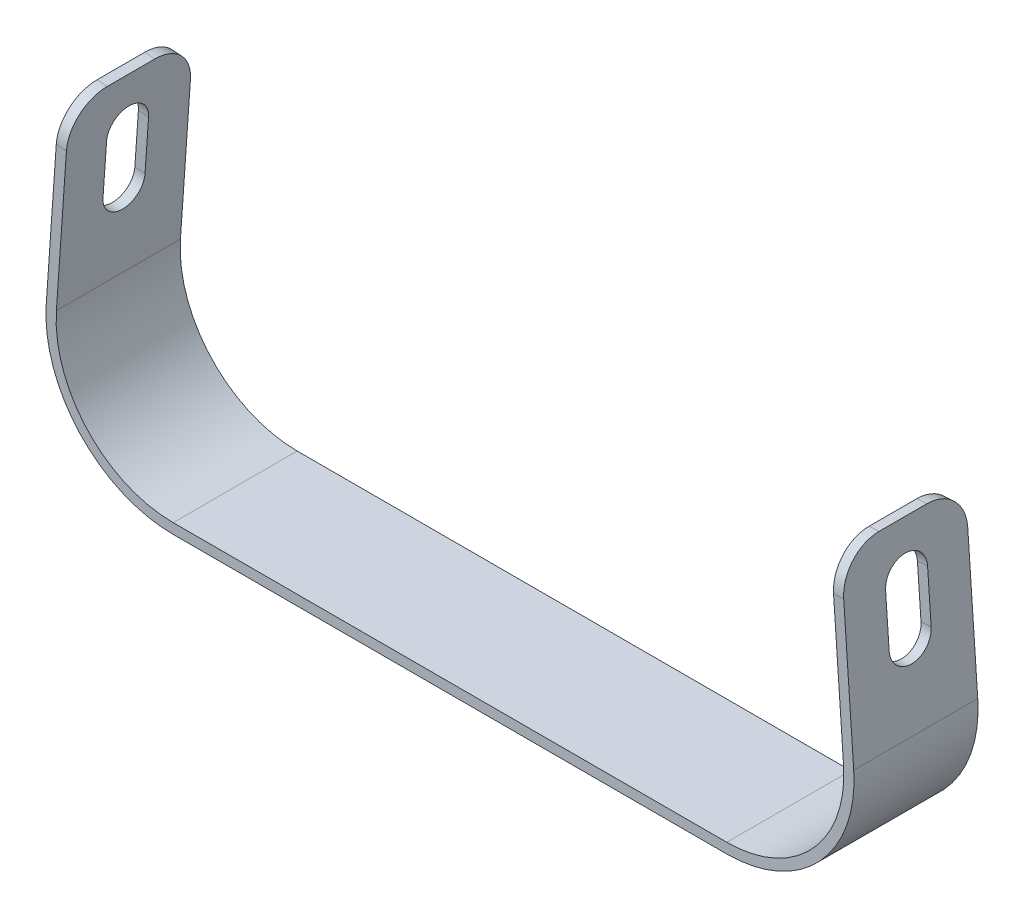
ISO-10303-21;
HEADER;
FILE_DESCRIPTION(('STEP AP214'),'2;1');
FILE_NAME('part.step','',(''),(''),'','','');
FILE_SCHEMA(('AUTOMOTIVE_DESIGN { 1 0 10303 214 1 1 1 1 }'));
ENDSEC;
DATA;
#1=APPLICATION_CONTEXT('core data for automotive mechanical design processes');
#2=APPLICATION_PROTOCOL_DEFINITION('international standard','automotive_design',2000,#1);
#3=PRODUCT_CONTEXT('',#1,'mechanical');
#4=PRODUCT('Part','Part','',(#3));
#5=PRODUCT_RELATED_PRODUCT_CATEGORY('part','',(#4));
#6=PRODUCT_DEFINITION_FORMATION('','',#4);
#7=PRODUCT_DEFINITION_CONTEXT('part definition',#1,'design');
#8=PRODUCT_DEFINITION('design','',#6,#7);
#9=PRODUCT_DEFINITION_SHAPE('','',#8);
#10=(LENGTH_UNIT() NAMED_UNIT(*) SI_UNIT(.MILLI.,.METRE.));
#11=(NAMED_UNIT(*) PLANE_ANGLE_UNIT() SI_UNIT($,.RADIAN.));
#12=(NAMED_UNIT(*) SI_UNIT($,.STERADIAN.) SOLID_ANGLE_UNIT());
#13=UNCERTAINTY_MEASURE_WITH_UNIT(LENGTH_MEASURE(1.E-05),#10,'distance_accuracy_value','');
#14=(GEOMETRIC_REPRESENTATION_CONTEXT(3) GLOBAL_UNCERTAINTY_ASSIGNED_CONTEXT((#13)) GLOBAL_UNIT_ASSIGNED_CONTEXT((#10,
#11,#12)) REPRESENTATION_CONTEXT('',''));
#15=CARTESIAN_POINT('',(0.,0.,0.));
#16=DIRECTION('',(0.,0.,1.));
#17=DIRECTION('',(1.,0.,0.));
#18=AXIS2_PLACEMENT_3D('',#15,#16,#17);
#19=CARTESIAN_POINT('',(452.110985161686,-170.979477552014,-494.449999926082));
#20=DIRECTION('',(0.997564050259824,-0.0697564737441253,0.));
#21=DIRECTION('',(0.0697564737441253,0.997564050259824,0.));
#22=AXIS2_PLACEMENT_3D('',#19,#20,#21);
#23=CYLINDRICAL_SURFACE('',#22,6.);
#24=DIRECTION('',(0.997564050259824,-0.0697564737441253,0.));
#25=VECTOR('',#24,1.);
#26=CARTESIAN_POINT('',(452.110985161686,-170.979477552014,-488.449999926082));
#27=LINE('',#26,#25);
#28=CARTESIAN_POINT('',(414.620123332679,-168.357861107297,-488.449999926082));
#29=VERTEX_POINT('',#28);
#30=CARTESIAN_POINT('',(416.216225813094,-168.469471465288,-488.449999926082));
#31=VERTEX_POINT('',#30);
#32=EDGE_CURVE('E254',#29,#31,#27,.T.);
#33=ORIENTED_EDGE('',*,*,#32,.T.);
#34=CARTESIAN_POINT('',(416.216225813094,-168.469471465287,-494.449999926082));
#35=DIRECTION('',(0.997564050259824,-0.0697564737441253,0.));
#36=DIRECTION('',(0.0697564737441253,0.997564050259824,0.));
#37=AXIS2_PLACEMENT_3D('',#34,#35,#36);
#38=CIRCLE('',#37,6.);
#39=CARTESIAN_POINT('',(416.634764655559,-162.484087163729,-494.449999926082));
#40=VERTEX_POINT('',#39);
#41=EDGE_CURVE('E350',#31,#40,#38,.F.);
#42=ORIENTED_EDGE('',*,*,#41,.T.);
#43=DIRECTION('',(-0.997564050259824,0.0697564737441253,0.));
#44=VECTOR('',#43,1.);
#45=CARTESIAN_POINT('',(416.634764655559,-162.484087163729,-494.449999926082));
#46=LINE('',#45,#44);
#47=CARTESIAN_POINT('',(415.038662175143,-162.372476805738,-494.449999926082));
#48=VERTEX_POINT('',#47);
#49=EDGE_CURVE('E247',#48,#40,#46,.F.);
#50=ORIENTED_EDGE('',*,*,#49,.F.);
#51=CARTESIAN_POINT('',(414.620123332678,-168.357861107297,-494.449999926082));
#52=DIRECTION('',(0.997564050259824,-0.0697564737441253,0.));
#53=DIRECTION('',(0.0697564737441253,0.997564050259824,0.));
#54=AXIS2_PLACEMENT_3D('',#51,#52,#53);
#55=CIRCLE('',#54,6.);
#56=EDGE_CURVE('E331',#29,#48,#55,.F.);
#57=ORIENTED_EDGE('',*,*,#56,.F.);
#58=EDGE_LOOP('',(#33,#42,#50,#57));
#59=FACE_BOUND('',#58,.T.);
#60=ADVANCED_FACE('F16',(#59),#23,.T.);
#61=CARTESIAN_POINT('',(416.634764655559,-162.484087163729,-510.95));
#62=DIRECTION('',(0.0697564737441253,0.997564050259824,0.));
#63=DIRECTION('',(-0.997564050259824,0.0697564737441253,0.));
#64=AXIS2_PLACEMENT_3D('',#61,#62,#63);
#65=PLANE('',#64);
#66=DIRECTION('',(0.997564050259824,-0.0697564737441253,0.));
#67=VECTOR('',#66,1.);
#68=CARTESIAN_POINT('',(452.529524004151,-164.994093250455,-501.95));
#69=LINE('',#68,#67);
#70=CARTESIAN_POINT('',(415.038662175144,-162.372476805738,-501.95));
#71=VERTEX_POINT('',#70);
#72=CARTESIAN_POINT('',(416.634764655559,-162.484087163729,-501.95));
#73=VERTEX_POINT('',#72);
#74=EDGE_CURVE('E243',#71,#73,#69,.T.);
#75=ORIENTED_EDGE('',*,*,#74,.F.);
#76=DIRECTION('',(0.,0.,1.));
#77=VECTOR('',#76,1.);
#78=CARTESIAN_POINT('',(415.038662175144,-162.372476805738,-133.95));
#79=LINE('',#78,#77);
#80=EDGE_CURVE('E330',#48,#71,#79,.F.);
#81=ORIENTED_EDGE('',*,*,#80,.F.);
#82=ORIENTED_EDGE('',*,*,#49,.T.);
#83=DIRECTION('',(0.,0.,1.));
#84=VECTOR('',#83,1.);
#85=CARTESIAN_POINT('',(416.634764655559,-162.484087163729,-133.95));
#86=LINE('',#85,#84);
#87=EDGE_CURVE('E349',#40,#73,#86,.F.);
#88=ORIENTED_EDGE('',*,*,#87,.T.);
#89=EDGE_LOOP('',(#75,#81,#82,#88));
#90=FACE_BOUND('',#89,.T.);
#91=ADVANCED_FACE('F506',(#90),#65,.T.);
#92=CARTESIAN_POINT('',(452.110985161686,-170.979477552014,-501.95));
#93=DIRECTION('',(0.997564050259824,-0.0697564737441253,0.));
#94=DIRECTION('',(0.0697564737441253,0.997564050259824,0.));
#95=AXIS2_PLACEMENT_3D('',#92,#93,#94);
#96=CYLINDRICAL_SURFACE('',#95,6.);
#97=ORIENTED_EDGE('',*,*,#74,.T.);
#98=CARTESIAN_POINT('',(416.216225813094,-168.469471465287,-501.95));
#99=DIRECTION('',(0.997564050259824,-0.0697564737441253,0.));
#100=DIRECTION('',(0.0697564737441253,0.997564050259824,0.));
#101=AXIS2_PLACEMENT_3D('',#98,#99,#100);
#102=CIRCLE('',#101,6.);
#103=CARTESIAN_POINT('',(416.216225813094,-168.469471465288,-507.95));
#104=VERTEX_POINT('',#103);
#105=EDGE_CURVE('E345',#73,#104,#102,.F.);
#106=ORIENTED_EDGE('',*,*,#105,.T.);
#107=DIRECTION('',(0.997564050259824,-0.0697564737441253,0.));
#108=VECTOR('',#107,1.);
#109=CARTESIAN_POINT('',(452.110985161686,-170.979477552015,-507.95));
#110=LINE('',#109,#108);
#111=CARTESIAN_POINT('',(414.620123332679,-168.357861107297,-507.95));
#112=VERTEX_POINT('',#111);
#113=EDGE_CURVE('E244',#104,#112,#110,.F.);
#114=ORIENTED_EDGE('',*,*,#113,.T.);
#115=CARTESIAN_POINT('',(414.620123332679,-168.357861107297,-501.95));
#116=DIRECTION('',(0.997564050259824,-0.0697564737441253,0.));
#117=DIRECTION('',(0.0697564737441253,0.997564050259824,0.));
#118=AXIS2_PLACEMENT_3D('',#115,#116,#117);
#119=CIRCLE('',#118,6.);
#120=EDGE_CURVE('E326',#71,#112,#119,.F.);
#121=ORIENTED_EDGE('',*,*,#120,.F.);
#122=EDGE_LOOP('',(#97,#106,#114,#121));
#123=FACE_BOUND('',#122,.T.);
#124=ADVANCED_FACE('F503',(#123),#96,.T.);
#125=CARTESIAN_POINT('',(413.922558595237,-178.333501609896,-501.499999963041));
#126=DIRECTION('',(0.,0.,1.));
#127=DIRECTION('',(0.,-1.,0.));
#128=AXIS2_PLACEMENT_3D('',#125,#126,#127);
#129=PLANE('',#128);
#130=DIRECTION('',(-0.0697564737441253,-0.997564050259824,0.));
#131=VECTOR('',#130,1.);
#132=CARTESIAN_POINT('',(411.375149748335,-237.700084590764,-501.499999963041));
#133=LINE('',#132,#131);
#134=CARTESIAN_POINT('',(415.518661075653,-178.445111967887,-501.499999963041));
#135=VERTEX_POINT('',#134);
#136=CARTESIAN_POINT('',(416.076712865606,-170.464599565808,-501.499999963041));
#137=VERTEX_POINT('',#136);
#138=EDGE_CURVE('E335',#135,#137,#133,.F.);
#139=ORIENTED_EDGE('',*,*,#138,.T.);
#140=DIRECTION('',(-0.997564050259824,0.0697564737441253,0.));
#141=VECTOR('',#140,1.);
#142=CARTESIAN_POINT('',(414.480610385191,-170.352989207817,-501.499999963041));
#143=LINE('',#142,#141);
#144=CARTESIAN_POINT('',(414.48061038519,-170.352989207817,-501.499999963041));
#145=VERTEX_POINT('',#144);
#146=EDGE_CURVE('E240',#137,#145,#143,.T.);
#147=ORIENTED_EDGE('',*,*,#146,.T.);
#148=DIRECTION('',(-0.0697564737441253,-0.997564050259824,0.));
#149=VECTOR('',#148,1.);
#150=CARTESIAN_POINT('',(409.77904726792,-237.588474232773,-501.499999963041));
#151=LINE('',#150,#149);
#152=CARTESIAN_POINT('',(413.922558595237,-178.333501609896,-501.499999963041));
#153=VERTEX_POINT('',#152);
#154=EDGE_CURVE('E325',#153,#145,#151,.F.);
#155=ORIENTED_EDGE('',*,*,#154,.F.);
#156=DIRECTION('',(-0.997564050259824,0.0697564737441253,0.));
#157=VECTOR('',#156,1.);
#158=CARTESIAN_POINT('',(413.922558595237,-178.333501609896,-501.499999963041));
#159=LINE('',#158,#157);
#160=EDGE_CURVE('E233',#153,#135,#159,.F.);
#161=ORIENTED_EDGE('',*,*,#160,.T.);
#162=EDGE_LOOP('',(#139,#147,#155,#161));
#163=FACE_BOUND('',#162,.T.);
#164=ADVANCED_FACE('F567',(#163),#129,.T.);
#165=CARTESIAN_POINT('',(414.480610385191,-170.352989207817,-498.199999963041));
#166=DIRECTION('',(-0.997564050259824,0.0697564737441253,0.));
#167=DIRECTION('',(-0.0697564737441253,-0.997564050259824,0.));
#168=AXIS2_PLACEMENT_3D('',#165,#166,#167);
#169=CYLINDRICAL_SURFACE('',#168,3.3);
#170=ORIENTED_EDGE('',*,*,#146,.F.);
#171=CARTESIAN_POINT('',(416.076712865606,-170.464599565808,-498.199999963041));
#172=DIRECTION('',(-0.997564050259824,0.0697564737441253,0.));
#173=DIRECTION('',(-0.0697564737441253,-0.997564050259824,0.));
#174=AXIS2_PLACEMENT_3D('',#171,#172,#173);
#175=CIRCLE('',#174,3.3);
#176=CARTESIAN_POINT('',(416.076712865606,-170.464599565808,-494.899999963041));
#177=VERTEX_POINT('',#176);
#178=EDGE_CURVE('E341',#137,#177,#175,.F.);
#179=ORIENTED_EDGE('',*,*,#178,.T.);
#180=DIRECTION('',(0.997564050259809,-0.0697564737443516,0.));
#181=VECTOR('',#180,1.);
#182=CARTESIAN_POINT('',(414.48061038519,-170.352989207817,-494.899999963041));
#183=LINE('',#182,#181);
#184=CARTESIAN_POINT('',(414.48061038519,-170.352989207817,-494.899999963041));
#185=VERTEX_POINT('',#184);
#186=EDGE_CURVE('E236',#185,#177,#183,.T.);
#187=ORIENTED_EDGE('',*,*,#186,.F.);
#188=CARTESIAN_POINT('',(414.48061038519,-170.352989207817,-498.199999963041));
#189=DIRECTION('',(-0.997564050259824,0.0697564737441253,0.));
#190=DIRECTION('',(-0.0697564737441253,-0.997564050259824,0.));
#191=AXIS2_PLACEMENT_3D('',#188,#189,#190);
#192=CIRCLE('',#191,3.3);
#193=EDGE_CURVE('E321',#145,#185,#192,.F.);
#194=ORIENTED_EDGE('',*,*,#193,.F.);
#195=EDGE_LOOP('',(#170,#179,#187,#194));
#196=FACE_BOUND('',#195,.T.);
#197=ADVANCED_FACE('F563',(#196),#169,.F.);
#198=CARTESIAN_POINT('',(414.480610385191,-170.352989207817,-494.899999963041));
#199=DIRECTION('',(0.,0.,-1.));
#200=DIRECTION('',(0.,1.,0.));
#201=AXIS2_PLACEMENT_3D('',#198,#199,#200);
#202=PLANE('',#201);
#203=DIRECTION('',(-0.0697564737441253,-0.997564050259824,0.));
#204=VECTOR('',#203,1.);
#205=CARTESIAN_POINT('',(411.375149748335,-237.700084590764,-494.899999963041));
#206=LINE('',#205,#204);
#207=CARTESIAN_POINT('',(415.518661075653,-178.445111967886,-494.899999963041));
#208=VERTEX_POINT('',#207);
#209=EDGE_CURVE('E340',#177,#208,#206,.T.);
#210=ORIENTED_EDGE('',*,*,#209,.T.);
#211=DIRECTION('',(-0.997564050259824,0.0697564737441253,0.));
#212=VECTOR('',#211,1.);
#213=CARTESIAN_POINT('',(413.922558595237,-178.333501609895,-494.899999963041));
#214=LINE('',#213,#212);
#215=CARTESIAN_POINT('',(413.922558595237,-178.333501609896,-494.899999963041));
#216=VERTEX_POINT('',#215);
#217=EDGE_CURVE('E196',#208,#216,#214,.T.);
#218=ORIENTED_EDGE('',*,*,#217,.T.);
#219=DIRECTION('',(-0.0697564737441253,-0.997564050259824,0.));
#220=VECTOR('',#219,1.);
#221=CARTESIAN_POINT('',(409.77904726792,-237.588474232773,-494.899999963041));
#222=LINE('',#221,#220);
#223=EDGE_CURVE('E320',#185,#216,#222,.T.);
#224=ORIENTED_EDGE('',*,*,#223,.F.);
#225=ORIENTED_EDGE('',*,*,#186,.T.);
#226=EDGE_LOOP('',(#210,#218,#224,#225));
#227=FACE_BOUND('',#226,.T.);
#228=ADVANCED_FACE('F559',(#227),#202,.T.);
#229=CARTESIAN_POINT('',(413.922558595237,-178.333501609896,-498.199999963041));
#230=DIRECTION('',(-0.997564050259824,0.0697564737441253,0.));
#231=DIRECTION('',(-0.0697564737441253,-0.997564050259824,0.));
#232=AXIS2_PLACEMENT_3D('',#229,#230,#231);
#233=CYLINDRICAL_SURFACE('',#232,3.3);
#234=ORIENTED_EDGE('',*,*,#217,.F.);
#235=CARTESIAN_POINT('',(415.518661075653,-178.445111967887,-498.199999963041));
#236=DIRECTION('',(-0.997564050259824,0.0697564737441253,0.));
#237=DIRECTION('',(-0.0697564737441253,-0.997564050259824,0.));
#238=AXIS2_PLACEMENT_3D('',#235,#236,#237);
#239=CIRCLE('',#238,3.3);
#240=EDGE_CURVE('E336',#208,#135,#239,.F.);
#241=ORIENTED_EDGE('',*,*,#240,.T.);
#242=ORIENTED_EDGE('',*,*,#160,.F.);
#243=CARTESIAN_POINT('',(413.922558595237,-178.333501609896,-498.199999963041));
#244=DIRECTION('',(-0.997564050259824,0.0697564737441253,0.));
#245=DIRECTION('',(-0.0697564737441253,-0.997564050259824,0.));
#246=AXIS2_PLACEMENT_3D('',#243,#244,#245);
#247=CIRCLE('',#246,3.3);
#248=EDGE_CURVE('E316',#216,#153,#247,.F.);
#249=ORIENTED_EDGE('',*,*,#248,.F.);
#250=EDGE_LOOP('',(#234,#241,#242,#249));
#251=FACE_BOUND('',#250,.T.);
#252=ADVANCED_FACE('F556',(#251),#233,.F.);
#253=CARTESIAN_POINT('',(538.540694391833,-170.352989207817,-498.199999963041));
#254=DIRECTION('',(0.997564050259824,0.0697564737441253,0.));
#255=DIRECTION('',(-0.0697564737441253,0.997564050259824,0.));
#256=AXIS2_PLACEMENT_3D('',#253,#254,#255);
#257=CYLINDRICAL_SURFACE('',#256,3.3);
#258=DIRECTION('',(0.997564050259809,0.0697564737443516,0.));
#259=VECTOR('',#258,1.);
#260=CARTESIAN_POINT('',(536.944591911417,-170.464599565808,-494.899999963041));
#261=LINE('',#260,#259);
#262=CARTESIAN_POINT('',(536.944591911417,-170.464599565808,-494.899999963041));
#263=VERTEX_POINT('',#262);
#264=CARTESIAN_POINT('',(538.540694391833,-170.352989207817,-494.899999963041));
#265=VERTEX_POINT('',#264);
#266=EDGE_CURVE('E175',#263,#265,#261,.T.);
#267=ORIENTED_EDGE('',*,*,#266,.F.);
#268=CARTESIAN_POINT('',(536.944591911417,-170.464599565808,-498.199999963041));
#269=DIRECTION('',(0.997564050259824,0.0697564737441253,0.));
#270=DIRECTION('',(-0.0697564737441253,0.997564050259824,0.));
#271=AXIS2_PLACEMENT_3D('',#268,#269,#270);
#272=CIRCLE('',#271,3.3);
#273=CARTESIAN_POINT('',(536.944591911417,-170.464599565808,-501.499999963041));
#274=VERTEX_POINT('',#273);
#275=EDGE_CURVE('E19',#263,#274,#272,.F.);
#276=ORIENTED_EDGE('',*,*,#275,.T.);
#277=DIRECTION('',(-0.997564050259809,-0.0697564737443516,0.));
#278=VECTOR('',#277,1.);
#279=CARTESIAN_POINT('',(538.540694391833,-170.352989207817,-501.499999963041));
#280=LINE('',#279,#278);
#281=CARTESIAN_POINT('',(538.540694391833,-170.352989207817,-501.499999963041));
#282=VERTEX_POINT('',#281);
#283=EDGE_CURVE('E180',#282,#274,#280,.T.);
#284=ORIENTED_EDGE('',*,*,#283,.F.);
#285=CARTESIAN_POINT('',(538.540694391833,-170.352989207817,-498.199999963041));
#286=DIRECTION('',(0.997564050259824,0.0697564737441253,0.));
#287=DIRECTION('',(-0.0697564737441253,0.997564050259824,0.));
#288=AXIS2_PLACEMENT_3D('',#285,#286,#287);
#289=CIRCLE('',#288,3.3);
#290=EDGE_CURVE('E313',#265,#282,#289,.F.);
#291=ORIENTED_EDGE('',*,*,#290,.F.);
#292=EDGE_LOOP('',(#267,#276,#284,#291));
#293=FACE_BOUND('',#292,.T.);
#294=ADVANCED_FACE('F179',(#293),#257,.F.);
#295=CARTESIAN_POINT('',(538.540694391833,-170.352989207817,-501.499999963041));
#296=DIRECTION('',(0.,0.,1.));
#297=DIRECTION('',(1.,0.,0.));
#298=AXIS2_PLACEMENT_3D('',#295,#296,#297);
#299=PLANE('',#298);
#300=DIRECTION('',(-0.0697564737441253,0.997564050259824,0.));
#301=VECTOR('',#300,1.);
#302=CARTESIAN_POINT('',(545.651051633401,-294.972774327403,-501.499999963041));
#303=LINE('',#302,#301);
#304=CARTESIAN_POINT('',(537.50264370137,-178.445111967886,-501.499999963041));
#305=VERTEX_POINT('',#304);
#306=EDGE_CURVE('E186',#274,#305,#303,.F.);
#307=ORIENTED_EDGE('',*,*,#306,.T.);
#308=DIRECTION('',(0.997564050259824,0.0697564737441253,0.));
#309=VECTOR('',#308,1.);
#310=CARTESIAN_POINT('',(539.098746181786,-178.333501609895,-501.499999963041));
#311=LINE('',#310,#309);
#312=CARTESIAN_POINT('',(539.098746181786,-178.333501609896,-501.499999963041));
#313=VERTEX_POINT('',#312);
#314=EDGE_CURVE('E195',#305,#313,#311,.T.);
#315=ORIENTED_EDGE('',*,*,#314,.T.);
#316=DIRECTION('',(-0.0697564737441253,0.997564050259824,0.));
#317=VECTOR('',#316,1.);
#318=CARTESIAN_POINT('',(547.247154113816,-294.861163969412,-501.499999963041));
#319=LINE('',#318,#317);
#320=EDGE_CURVE('E192',#282,#313,#319,.F.);
#321=ORIENTED_EDGE('',*,*,#320,.F.);
#322=ORIENTED_EDGE('',*,*,#283,.T.);
#323=EDGE_LOOP('',(#307,#315,#321,#322));
#324=FACE_BOUND('',#323,.T.);
#325=ADVANCED_FACE('F189',(#324),#299,.T.);
#326=CARTESIAN_POINT('',(539.098746181786,-178.333501609896,-498.199999963041));
#327=DIRECTION('',(0.997564050259824,0.0697564737441253,0.));
#328=DIRECTION('',(-0.0697564737441253,0.997564050259824,0.));
#329=AXIS2_PLACEMENT_3D('',#326,#327,#328);
#330=CYLINDRICAL_SURFACE('',#329,3.3);
#331=ORIENTED_EDGE('',*,*,#314,.F.);
#332=CARTESIAN_POINT('',(537.50264370137,-178.445111967887,-498.199999963041));
#333=DIRECTION('',(0.997564050259824,0.0697564737441253,0.));
#334=DIRECTION('',(-0.0697564737441253,0.997564050259824,0.));
#335=AXIS2_PLACEMENT_3D('',#332,#333,#334);
#336=CIRCLE('',#335,3.3);
#337=CARTESIAN_POINT('',(537.50264370137,-178.445111967886,-494.899999963041));
#338=VERTEX_POINT('',#337);
#339=EDGE_CURVE('E200',#305,#338,#336,.F.);
#340=ORIENTED_EDGE('',*,*,#339,.T.);
#341=DIRECTION('',(-0.997564050259853,-0.0697564737437205,0.));
#342=VECTOR('',#341,1.);
#343=CARTESIAN_POINT('',(539.098746181786,-178.333501609896,-494.899999963041));
#344=LINE('',#343,#342);
#345=CARTESIAN_POINT('',(539.098746181786,-178.333501609896,-494.899999963041));
#346=VERTEX_POINT('',#345);
#347=EDGE_CURVE('E223',#346,#338,#344,.T.);
#348=ORIENTED_EDGE('',*,*,#347,.F.);
#349=CARTESIAN_POINT('',(539.098746181786,-178.333501609896,-498.199999963041));
#350=DIRECTION('',(0.997564050259824,0.0697564737441253,0.));
#351=DIRECTION('',(-0.0697564737441253,0.997564050259824,0.));
#352=AXIS2_PLACEMENT_3D('',#349,#350,#351);
#353=CIRCLE('',#352,3.3);
#354=EDGE_CURVE('E309',#313,#346,#353,.F.);
#355=ORIENTED_EDGE('',*,*,#354,.F.);
#356=EDGE_LOOP('',(#331,#340,#348,#355));
#357=FACE_BOUND('',#356,.T.);
#358=ADVANCED_FACE('F374',(#357),#330,.F.);
#359=CARTESIAN_POINT('',(539.16850265553,-179.331065660155,-494.899999963041));
#360=DIRECTION('',(0.,0.,-1.));
#361=DIRECTION('',(-1.,0.,0.));
#362=AXIS2_PLACEMENT_3D('',#359,#360,#361);
#363=PLANE('',#362);
#364=DIRECTION('',(-0.0697564737441253,0.997564050259824,0.));
#365=VECTOR('',#364,1.);
#366=CARTESIAN_POINT('',(545.651051633401,-294.972774327403,-494.899999963041));
#367=LINE('',#366,#365);
#368=EDGE_CURVE('E206',#338,#263,#367,.T.);
#369=ORIENTED_EDGE('',*,*,#368,.T.);
#370=ORIENTED_EDGE('',*,*,#266,.T.);
#371=DIRECTION('',(-0.0697564737441253,0.997564050259824,0.));
#372=VECTOR('',#371,1.);
#373=CARTESIAN_POINT('',(547.247154113816,-294.861163969412,-494.899999963041));
#374=LINE('',#373,#372);
#375=EDGE_CURVE('E308',#346,#265,#374,.T.);
#376=ORIENTED_EDGE('',*,*,#375,.F.);
#377=ORIENTED_EDGE('',*,*,#347,.T.);
#378=EDGE_LOOP('',(#369,#370,#376,#377));
#379=FACE_BOUND('',#378,.T.);
#380=ADVANCED_FACE('F369',(#379),#363,.T.);
#381=CARTESIAN_POINT('',(452.110985161686,-174.391859435323,-501.95));
#382=DIRECTION('',(-0.997564050259824,-0.0697564737441253,0.));
#383=DIRECTION('',(0.0697564737441253,-0.997564050259824,0.));
#384=AXIS2_PLACEMENT_3D('',#381,#382,#383);
#385=CYLINDRICAL_SURFACE('',#384,6.);
#386=DIRECTION('',(-0.997564050259824,-0.0697564737441253,0.));
#387=VECTOR('',#386,1.);
#388=CARTESIAN_POINT('',(452.110985161686,-174.391859435323,-507.95));
#389=LINE('',#388,#387);
#390=CARTESIAN_POINT('',(538.401181444344,-168.357861107297,-507.95));
#391=VERTEX_POINT('',#390);
#392=CARTESIAN_POINT('',(536.805078963929,-168.469471465288,-507.95));
#393=VERTEX_POINT('',#392);
#394=EDGE_CURVE('E220',#391,#393,#389,.T.);
#395=ORIENTED_EDGE('',*,*,#394,.T.);
#396=CARTESIAN_POINT('',(536.805078963929,-168.469471465288,-501.95));
#397=DIRECTION('',(-0.997564050259824,-0.0697564737441253,0.));
#398=DIRECTION('',(0.0697564737441253,-0.997564050259824,0.));
#399=AXIS2_PLACEMENT_3D('',#396,#397,#398);
#400=CIRCLE('',#399,6.);
#401=CARTESIAN_POINT('',(536.386540121464,-162.484087163729,-501.95));
#402=VERTEX_POINT('',#401);
#403=EDGE_CURVE('E360',#393,#402,#400,.F.);
#404=ORIENTED_EDGE('',*,*,#403,.T.);
#405=DIRECTION('',(-0.997564050259824,-0.0697564737441253,0.));
#406=VECTOR('',#405,1.);
#407=CARTESIAN_POINT('',(536.386540121464,-162.484087163729,-501.95));
#408=LINE('',#407,#406);
#409=CARTESIAN_POINT('',(537.98264260188,-162.372476805738,-501.95));
#410=VERTEX_POINT('',#409);
#411=EDGE_CURVE('E213',#410,#402,#408,.T.);
#412=ORIENTED_EDGE('',*,*,#411,.F.);
#413=CARTESIAN_POINT('',(538.401181444345,-168.357861107297,-501.95));
#414=DIRECTION('',(-0.997564050259824,-0.0697564737441253,0.));
#415=DIRECTION('',(0.0697564737441253,-0.997564050259824,0.));
#416=AXIS2_PLACEMENT_3D('',#413,#414,#415);
#417=CIRCLE('',#416,6.);
#418=EDGE_CURVE('E304',#391,#410,#417,.F.);
#419=ORIENTED_EDGE('',*,*,#418,.F.);
#420=EDGE_LOOP('',(#395,#404,#412,#419));
#421=FACE_BOUND('',#420,.T.);
#422=ADVANCED_FACE('F545',(#421),#385,.T.);
#423=CARTESIAN_POINT('',(536.386540121464,-162.484087163729,243.05));
#424=DIRECTION('',(-0.0697564737441253,0.997564050259824,0.));
#425=DIRECTION('',(-0.997564050259824,-0.0697564737441253,0.));
#426=AXIS2_PLACEMENT_3D('',#423,#424,#425);
#427=PLANE('',#426);
#428=DIRECTION('',(-0.997564050259824,-0.0697564737441253,0.));
#429=VECTOR('',#428,1.);
#430=CARTESIAN_POINT('',(451.692446319221,-168.406475133764,-494.449999926082));
#431=LINE('',#430,#429);
#432=CARTESIAN_POINT('',(537.982642601879,-162.372476805738,-494.449999926082));
#433=VERTEX_POINT('',#432);
#434=CARTESIAN_POINT('',(536.386540121464,-162.484087163729,-494.449999926082));
#435=VERTEX_POINT('',#434);
#436=EDGE_CURVE('E187',#433,#435,#431,.T.);
#437=ORIENTED_EDGE('',*,*,#436,.F.);
#438=DIRECTION('',(0.,0.,1.));
#439=VECTOR('',#438,1.);
#440=CARTESIAN_POINT('',(537.982642601879,-162.372476805738,-133.95));
#441=LINE('',#440,#439);
#442=EDGE_CURVE('E303',#410,#433,#441,.T.);
#443=ORIENTED_EDGE('',*,*,#442,.F.);
#444=ORIENTED_EDGE('',*,*,#411,.T.);
#445=DIRECTION('',(0.,0.,1.));
#446=VECTOR('',#445,1.);
#447=CARTESIAN_POINT('',(536.386540121464,-162.484087163729,-133.95));
#448=LINE('',#447,#446);
#449=EDGE_CURVE('E359',#402,#435,#448,.T.);
#450=ORIENTED_EDGE('',*,*,#449,.T.);
#451=EDGE_LOOP('',(#437,#443,#444,#450));
#452=FACE_BOUND('',#451,.T.);
#453=ADVANCED_FACE('F461',(#452),#427,.T.);
#454=CARTESIAN_POINT('',(452.110985161686,-174.391859435323,-494.449999926082));
#455=DIRECTION('',(-0.997564050259824,-0.0697564737441253,0.));
#456=DIRECTION('',(0.0697564737441253,-0.997564050259824,0.));
#457=AXIS2_PLACEMENT_3D('',#454,#455,#456);
#458=CYLINDRICAL_SURFACE('',#457,6.);
#459=ORIENTED_EDGE('',*,*,#436,.T.);
#460=CARTESIAN_POINT('',(536.805078963929,-168.469471465288,-494.449999926082));
#461=DIRECTION('',(-0.997564050259824,-0.0697564737441253,0.));
#462=DIRECTION('',(0.0697564737441253,-0.997564050259824,0.));
#463=AXIS2_PLACEMENT_3D('',#460,#461,#462);
#464=CIRCLE('',#463,6.);
#465=CARTESIAN_POINT('',(536.805078963929,-168.469471465288,-488.449999926082));
#466=VERTEX_POINT('',#465);
#467=EDGE_CURVE('E354',#435,#466,#464,.F.);
#468=ORIENTED_EDGE('',*,*,#467,.T.);
#469=DIRECTION('',(-0.997564050259824,-0.0697564737441253,0.));
#470=VECTOR('',#469,1.);
#471=CARTESIAN_POINT('',(452.110985161686,-174.391859435323,-488.449999926082));
#472=LINE('',#471,#470);
#473=CARTESIAN_POINT('',(538.401181444344,-168.357861107297,-488.449999926082));
#474=VERTEX_POINT('',#473);
#475=EDGE_CURVE('E210',#466,#474,#472,.F.);
#476=ORIENTED_EDGE('',*,*,#475,.T.);
#477=CARTESIAN_POINT('',(538.401181444344,-168.357861107297,-494.449999926082));
#478=DIRECTION('',(-0.997564050259824,-0.0697564737441253,0.));
#479=DIRECTION('',(0.0697564737441253,-0.997564050259824,0.));
#480=AXIS2_PLACEMENT_3D('',#477,#478,#479);
#481=CIRCLE('',#480,6.);
#482=EDGE_CURVE('E298',#433,#474,#481,.F.);
#483=ORIENTED_EDGE('',*,*,#482,.F.);
#484=EDGE_LOOP('',(#459,#468,#476,#483));
#485=FACE_BOUND('',#484,.T.);
#486=ADVANCED_FACE('F464',(#485),#458,.T.);
#487=CARTESIAN_POINT('',(545.651051633401,-294.972774327403,-133.95));
#488=DIRECTION('',(0.997564050259824,0.0697564737441253,0.));
#489=DIRECTION('',(-0.0697564737441253,0.997564050259824,0.));
#490=AXIS2_PLACEMENT_3D('',#487,#488,#489);
#491=PLANE('',#490);
#492=DIRECTION('',(0.069756473744121,-0.997564050259825,0.));
#493=VECTOR('',#492,1.);
#494=CARTESIAN_POINT('',(536.805078963929,-168.469471465288,-488.449999926082));
#495=LINE('',#494,#493);
#496=CARTESIAN_POINT('',(538.380955302983,-191.005553051951,-488.449999926082));
#497=VERTEX_POINT('',#496);
#498=EDGE_CURVE('E275',#466,#497,#495,.T.);
#499=ORIENTED_EDGE('',*,*,#498,.F.);
#500=ORIENTED_EDGE('',*,*,#467,.F.);
#501=ORIENTED_EDGE('',*,*,#449,.F.);
#502=ORIENTED_EDGE('',*,*,#403,.F.);
#503=DIRECTION('',(-0.069756473744121,0.997564050259825,0.));
#504=VECTOR('',#503,1.);
#505=CARTESIAN_POINT('',(538.380955302983,-191.005553051951,-507.95));
#506=LINE('',#505,#504);
#507=CARTESIAN_POINT('',(538.380955302983,-191.005553051951,-507.95));
#508=VERTEX_POINT('',#507);
#509=EDGE_CURVE('E291',#508,#393,#506,.T.);
#510=ORIENTED_EDGE('',*,*,#509,.F.);
#511=DIRECTION('',(0.,0.,-1.));
#512=VECTOR('',#511,1.);
#513=CARTESIAN_POINT('',(538.380955302983,-191.005553051951,-133.95));
#514=LINE('',#513,#512);
#515=EDGE_CURVE('E358',#508,#497,#514,.F.);
#516=ORIENTED_EDGE('',*,*,#515,.T.);
#517=EDGE_LOOP('',(#499,#500,#501,#502,#510,#516));
#518=FACE_BOUND('',#517,.T.);
#519=ORIENTED_EDGE('',*,*,#339,.F.);
#520=ORIENTED_EDGE('',*,*,#306,.F.);
#521=ORIENTED_EDGE('',*,*,#275,.F.);
#522=ORIENTED_EDGE('',*,*,#368,.F.);
#523=EDGE_LOOP('',(#519,#520,#521,#522));
#524=FACE_BOUND('',#523,.T.);
#525=ADVANCED_FACE('F199',(#518,#524),#491,.F.);
#526=CARTESIAN_POINT('',(520.025776778202,-192.289072168843,-133.95));
#527=DIRECTION('',(0.,0.,-1.));
#528=DIRECTION('',(-1.,0.,0.));
#529=AXIS2_PLACEMENT_3D('',#526,#527,#528);
#530=CYLINDRICAL_SURFACE('',#529,18.4);
#531=CARTESIAN_POINT('',(520.025776778202,-192.289072168843,-507.95));
#532=DIRECTION('',(0.,0.,-1.));
#533=DIRECTION('',(-1.,0.,0.));
#534=AXIS2_PLACEMENT_3D('',#531,#532,#533);
#535=CIRCLE('',#534,18.4);
#536=CARTESIAN_POINT('',(520.025776778202,-210.689072168843,-507.95));
#537=VERTEX_POINT('',#536);
#538=EDGE_CURVE('E287',#537,#508,#535,.F.);
#539=ORIENTED_EDGE('',*,*,#538,.F.);
#540=DIRECTION('',(0.,0.,-1.));
#541=VECTOR('',#540,1.);
#542=CARTESIAN_POINT('',(520.025776778202,-210.689072168843,-133.95));
#543=LINE('',#542,#541);
#544=CARTESIAN_POINT('',(520.025776778202,-210.689072168843,-488.449999926082));
#545=VERTEX_POINT('',#544);
#546=EDGE_CURVE('E404',#537,#545,#543,.F.);
#547=ORIENTED_EDGE('',*,*,#546,.T.);
#548=CARTESIAN_POINT('',(520.025776778202,-192.289072168843,-488.449999926082));
#549=DIRECTION('',(0.,0.,-1.));
#550=DIRECTION('',(-1.,0.,0.));
#551=AXIS2_PLACEMENT_3D('',#548,#549,#550);
#552=CIRCLE('',#551,18.4);
#553=EDGE_CURVE('E271',#497,#545,#552,.T.);
#554=ORIENTED_EDGE('',*,*,#553,.F.);
#555=ORIENTED_EDGE('',*,*,#515,.F.);
#556=EDGE_LOOP('',(#539,#547,#554,#555));
#557=FACE_BOUND('',#556,.T.);
#558=ADVANCED_FACE('F418',(#557),#530,.F.);
#559=CARTESIAN_POINT('',(447.804380484607,-210.689072168843,-133.95));
#560=DIRECTION('',(0.,-1.,0.));
#561=DIRECTION('',(0.,0.,-1.));
#562=AXIS2_PLACEMENT_3D('',#559,#560,#561);
#563=PLANE('',#562);
#564=DIRECTION('',(1.,0.,0.));
#565=VECTOR('',#564,1.);
#566=CARTESIAN_POINT('',(415.200392526002,-210.689072168843,-488.449999926082));
#567=LINE('',#566,#565);
#568=CARTESIAN_POINT('',(432.995527998821,-210.689072168843,-488.449999926082));
#569=VERTEX_POINT('',#568);
#570=EDGE_CURVE('E270',#545,#569,#567,.F.);
#571=ORIENTED_EDGE('',*,*,#570,.F.);
#572=ORIENTED_EDGE('',*,*,#546,.F.);
#573=DIRECTION('',(-1.,0.,0.));
#574=VECTOR('',#573,1.);
#575=CARTESIAN_POINT('',(542.79405339825,-210.689072168843,-507.95));
#576=LINE('',#575,#574);
#577=CARTESIAN_POINT('',(432.995527998821,-210.689072168843,-507.95));
#578=VERTEX_POINT('',#577);
#579=EDGE_CURVE('E292',#578,#537,#576,.F.);
#580=ORIENTED_EDGE('',*,*,#579,.F.);
#581=DIRECTION('',(0.,0.,-1.));
#582=VECTOR('',#581,1.);
#583=CARTESIAN_POINT('',(432.995527998821,-210.689072168843,-133.95));
#584=LINE('',#583,#582);
#585=EDGE_CURVE('E353',#578,#569,#584,.F.);
#586=ORIENTED_EDGE('',*,*,#585,.T.);
#587=EDGE_LOOP('',(#571,#572,#580,#586));
#588=FACE_BOUND('',#587,.T.);
#589=ADVANCED_FACE('F470',(#588),#563,.F.);
#590=CARTESIAN_POINT('',(432.995527998821,-192.289072168843,-133.95));
#591=DIRECTION('',(0.,0.,-1.));
#592=DIRECTION('',(-1.,0.,0.));
#593=AXIS2_PLACEMENT_3D('',#590,#591,#592);
#594=CYLINDRICAL_SURFACE('',#593,18.4);
#595=CARTESIAN_POINT('',(432.995527998821,-192.289072168843,-507.95));
#596=DIRECTION('',(0.,0.,-1.));
#597=DIRECTION('',(-1.,0.,0.));
#598=AXIS2_PLACEMENT_3D('',#595,#596,#597);
#599=CIRCLE('',#598,18.4);
#600=CARTESIAN_POINT('',(414.64034947404,-191.005553051951,-507.95));
#601=VERTEX_POINT('',#600);
#602=EDGE_CURVE('E293',#601,#578,#599,.F.);
#603=ORIENTED_EDGE('',*,*,#602,.F.);
#604=DIRECTION('',(0.,0.,1.));
#605=VECTOR('',#604,1.);
#606=CARTESIAN_POINT('',(414.64034947404,-191.005553051951,-133.95));
#607=LINE('',#606,#605);
#608=CARTESIAN_POINT('',(414.64034947404,-191.005553051951,-488.449999926082));
#609=VERTEX_POINT('',#608);
#610=EDGE_CURVE('E344',#601,#609,#607,.T.);
#611=ORIENTED_EDGE('',*,*,#610,.T.);
#612=CARTESIAN_POINT('',(432.995527998821,-192.289072168843,-488.449999926082));
#613=DIRECTION('',(0.,0.,-1.));
#614=DIRECTION('',(-1.,0.,0.));
#615=AXIS2_PLACEMENT_3D('',#612,#613,#614);
#616=CIRCLE('',#615,18.4);
#617=EDGE_CURVE('E265',#569,#609,#616,.T.);
#618=ORIENTED_EDGE('',*,*,#617,.F.);
#619=ORIENTED_EDGE('',*,*,#585,.F.);
#620=EDGE_LOOP('',(#603,#611,#618,#619));
#621=FACE_BOUND('',#620,.T.);
#622=ADVANCED_FACE('F477',(#621),#594,.F.);
#623=CARTESIAN_POINT('',(411.375149748335,-237.700084590764,-133.95));
#624=DIRECTION('',(-0.997564050259824,0.0697564737441253,0.));
#625=DIRECTION('',(-0.0697564737441253,-0.997564050259824,0.));
#626=AXIS2_PLACEMENT_3D('',#623,#624,#625);
#627=PLANE('',#626);
#628=ORIENTED_EDGE('',*,*,#240,.F.);
#629=ORIENTED_EDGE('',*,*,#209,.F.);
#630=ORIENTED_EDGE('',*,*,#178,.F.);
#631=ORIENTED_EDGE('',*,*,#138,.F.);
#632=EDGE_LOOP('',(#628,#629,#630,#631));
#633=FACE_BOUND('',#632,.T.);
#634=DIRECTION('',(-0.0697564737441161,-0.997564050259825,0.));
#635=VECTOR('',#634,1.);
#636=CARTESIAN_POINT('',(416.216225813094,-168.469471465288,-507.95));
#637=LINE('',#636,#635);
#638=EDGE_CURVE('E297',#104,#601,#637,.T.);
#639=ORIENTED_EDGE('',*,*,#638,.F.);
#640=ORIENTED_EDGE('',*,*,#105,.F.);
#641=ORIENTED_EDGE('',*,*,#87,.F.);
#642=ORIENTED_EDGE('',*,*,#41,.F.);
#643=DIRECTION('',(0.0697564737441161,0.997564050259825,0.));
#644=VECTOR('',#643,1.);
#645=CARTESIAN_POINT('',(414.64034947404,-191.005553051951,-488.449999926082));
#646=LINE('',#645,#644);
#647=EDGE_CURVE('E269',#609,#31,#646,.T.);
#648=ORIENTED_EDGE('',*,*,#647,.F.);
#649=ORIENTED_EDGE('',*,*,#610,.F.);
#650=EDGE_LOOP('',(#639,#640,#641,#642,#648,#649));
#651=FACE_BOUND('',#650,.T.);
#652=ADVANCED_FACE('F481',(#633,#651),#627,.F.);
#653=CARTESIAN_POINT('',(409.77904726792,-237.588474232773,-133.95));
#654=DIRECTION('',(-0.997564050259824,0.0697564737441253,0.));
#655=DIRECTION('',(-0.0697564737441253,-0.997564050259824,0.));
#656=AXIS2_PLACEMENT_3D('',#653,#654,#655);
#657=PLANE('',#656);
#658=ORIENTED_EDGE('',*,*,#223,.T.);
#659=ORIENTED_EDGE('',*,*,#248,.T.);
#660=ORIENTED_EDGE('',*,*,#154,.T.);
#661=ORIENTED_EDGE('',*,*,#193,.T.);
#662=EDGE_LOOP('',(#658,#659,#660,#661));
#663=FACE_BOUND('',#662,.T.);
#664=ORIENTED_EDGE('',*,*,#120,.T.);
#665=DIRECTION('',(0.0697564737441161,0.997564050259825,0.));
#666=VECTOR('',#665,1.);
#667=CARTESIAN_POINT('',(413.044246993625,-190.89394269396,-507.95));
#668=LINE('',#667,#666);
#669=CARTESIAN_POINT('',(413.044246993625,-190.89394269396,-507.95));
#670=VERTEX_POINT('',#669);
#671=EDGE_CURVE('E285',#670,#112,#668,.T.);
#672=ORIENTED_EDGE('',*,*,#671,.F.);
#673=DIRECTION('',(0.,0.,-1.));
#674=VECTOR('',#673,1.);
#675=CARTESIAN_POINT('',(413.044246993625,-190.89394269396,-133.95));
#676=LINE('',#675,#674);
#677=CARTESIAN_POINT('',(413.044246993625,-190.89394269396,-488.449999926082));
#678=VERTEX_POINT('',#677);
#679=EDGE_CURVE('E302',#678,#670,#676,.T.);
#680=ORIENTED_EDGE('',*,*,#679,.F.);
#681=DIRECTION('',(-0.0697564737441161,-0.997564050259825,0.));
#682=VECTOR('',#681,1.);
#683=CARTESIAN_POINT('',(414.620123332679,-168.357861107297,-488.449999926082));
#684=LINE('',#683,#682);
#685=EDGE_CURVE('E264',#29,#678,#684,.T.);
#686=ORIENTED_EDGE('',*,*,#685,.F.);
#687=ORIENTED_EDGE('',*,*,#56,.T.);
#688=ORIENTED_EDGE('',*,*,#80,.T.);
#689=EDGE_LOOP('',(#664,#672,#680,#686,#687,#688));
#690=FACE_BOUND('',#689,.T.);
#691=ADVANCED_FACE('F499',(#663,#690),#657,.T.);
#692=CARTESIAN_POINT('',(547.247154113816,-294.861163969412,-133.95));
#693=DIRECTION('',(0.997564050259824,0.0697564737441253,0.));
#694=DIRECTION('',(-0.0697564737441253,0.997564050259824,0.));
#695=AXIS2_PLACEMENT_3D('',#692,#693,#694);
#696=PLANE('',#695);
#697=ORIENTED_EDGE('',*,*,#482,.T.);
#698=DIRECTION('',(-0.0697564737441601,0.997564050259822,0.));
#699=VECTOR('',#698,1.);
#700=CARTESIAN_POINT('',(539.977057783399,-190.89394269396,-488.449999926082));
#701=LINE('',#700,#699);
#702=CARTESIAN_POINT('',(539.977057783399,-190.89394269396,-488.449999926082));
#703=VERTEX_POINT('',#702);
#704=EDGE_CURVE('E259',#703,#474,#701,.T.);
#705=ORIENTED_EDGE('',*,*,#704,.F.);
#706=DIRECTION('',(0.,0.,-1.));
#707=VECTOR('',#706,1.);
#708=CARTESIAN_POINT('',(539.977057783399,-190.89394269396,-133.95));
#709=LINE('',#708,#707);
#710=CARTESIAN_POINT('',(539.977057783399,-190.89394269396,-507.95));
#711=VERTEX_POINT('',#710);
#712=EDGE_CURVE('E280',#711,#703,#709,.F.);
#713=ORIENTED_EDGE('',*,*,#712,.F.);
#714=DIRECTION('',(0.0697564737441601,-0.997564050259822,0.));
#715=VECTOR('',#714,1.);
#716=CARTESIAN_POINT('',(538.401181444344,-168.357861107297,-507.95));
#717=LINE('',#716,#715);
#718=EDGE_CURVE('E286',#391,#711,#717,.T.);
#719=ORIENTED_EDGE('',*,*,#718,.F.);
#720=ORIENTED_EDGE('',*,*,#418,.T.);
#721=ORIENTED_EDGE('',*,*,#442,.T.);
#722=EDGE_LOOP('',(#697,#705,#713,#719,#720,#721));
#723=FACE_BOUND('',#722,.T.);
#724=ORIENTED_EDGE('',*,*,#354,.T.);
#725=ORIENTED_EDGE('',*,*,#375,.T.);
#726=ORIENTED_EDGE('',*,*,#290,.T.);
#727=ORIENTED_EDGE('',*,*,#320,.T.);
#728=EDGE_LOOP('',(#724,#725,#726,#727));
#729=FACE_BOUND('',#728,.T.);
#730=ADVANCED_FACE('F376',(#723,#729),#696,.T.);
#731=CARTESIAN_POINT('',(432.995527998821,-192.289072168843,-133.95));
#732=DIRECTION('',(0.,0.,-1.));
#733=DIRECTION('',(-1.,0.,0.));
#734=AXIS2_PLACEMENT_3D('',#731,#732,#733);
#735=CYLINDRICAL_SURFACE('',#734,20.);
#736=ORIENTED_EDGE('',*,*,#679,.T.);
#737=CARTESIAN_POINT('',(432.995527998821,-192.289072168843,-507.95));
#738=DIRECTION('',(0.,0.,-1.));
#739=DIRECTION('',(-1.,0.,0.));
#740=AXIS2_PLACEMENT_3D('',#737,#738,#739);
#741=CIRCLE('',#740,20.);
#742=CARTESIAN_POINT('',(432.995527998821,-212.289072168843,-507.95));
#743=VERTEX_POINT('',#742);
#744=EDGE_CURVE('E281',#743,#670,#741,.T.);
#745=ORIENTED_EDGE('',*,*,#744,.F.);
#746=DIRECTION('',(0.,0.,-1.));
#747=VECTOR('',#746,1.);
#748=CARTESIAN_POINT('',(432.995527998821,-212.289072168843,-133.95));
#749=LINE('',#748,#747);
#750=CARTESIAN_POINT('',(432.995527998821,-212.289072168843,-488.449999926082));
#751=VERTEX_POINT('',#750);
#752=EDGE_CURVE('E433',#751,#743,#749,.T.);
#753=ORIENTED_EDGE('',*,*,#752,.F.);
#754=CARTESIAN_POINT('',(432.995527998821,-192.289072168843,-488.449999926082));
#755=DIRECTION('',(0.,0.,-1.));
#756=DIRECTION('',(-1.,0.,0.));
#757=AXIS2_PLACEMENT_3D('',#754,#755,#756);
#758=CIRCLE('',#757,20.);
#759=EDGE_CURVE('E260',#678,#751,#758,.F.);
#760=ORIENTED_EDGE('',*,*,#759,.F.);
#761=EDGE_LOOP('',(#736,#745,#753,#760));
#762=FACE_BOUND('',#761,.T.);
#763=ADVANCED_FACE('F495',(#762),#735,.T.);
#764=CARTESIAN_POINT('',(542.79405339825,-224.028523700214,-507.95));
#765=DIRECTION('',(0.,0.,-1.));
#766=DIRECTION('',(-1.,0.,0.));
#767=AXIS2_PLACEMENT_3D('',#764,#765,#766);
#768=PLANE('',#767);
#769=ORIENTED_EDGE('',*,*,#744,.T.);
#770=ORIENTED_EDGE('',*,*,#671,.T.);
#771=ORIENTED_EDGE('',*,*,#113,.F.);
#772=ORIENTED_EDGE('',*,*,#638,.T.);
#773=ORIENTED_EDGE('',*,*,#602,.T.);
#774=ORIENTED_EDGE('',*,*,#579,.T.);
#775=ORIENTED_EDGE('',*,*,#538,.T.);
#776=ORIENTED_EDGE('',*,*,#509,.T.);
#777=ORIENTED_EDGE('',*,*,#394,.F.);
#778=ORIENTED_EDGE('',*,*,#718,.T.);
#779=CARTESIAN_POINT('',(520.025776778202,-192.289072168843,-507.95));
#780=DIRECTION('',(0.,0.,-1.));
#781=DIRECTION('',(-1.,0.,0.));
#782=AXIS2_PLACEMENT_3D('',#779,#780,#781);
#783=CIRCLE('',#782,20.);
#784=CARTESIAN_POINT('',(520.025776778202,-212.289072168843,-507.95));
#785=VERTEX_POINT('',#784);
#786=EDGE_CURVE('E276',#785,#711,#783,.F.);
#787=ORIENTED_EDGE('',*,*,#786,.F.);
#788=DIRECTION('',(1.,0.,0.));
#789=VECTOR('',#788,1.);
#790=CARTESIAN_POINT('',(447.804380484607,-212.289072168843,-507.95));
#791=LINE('',#790,#789);
#792=EDGE_CURVE('E431',#743,#785,#791,.T.);
#793=ORIENTED_EDGE('',*,*,#792,.F.);
#794=EDGE_LOOP('',(#769,#770,#771,#772,#773,#774,#775,#776,#777,#778,#787,#793));
#795=FACE_BOUND('',#794,.T.);
#796=ADVANCED_FACE('F466',(#795),#768,.T.);
#797=CARTESIAN_POINT('',(520.025776778202,-192.289072168843,-133.95));
#798=DIRECTION('',(0.,0.,-1.));
#799=DIRECTION('',(-1.,0.,0.));
#800=AXIS2_PLACEMENT_3D('',#797,#798,#799);
#801=CYLINDRICAL_SURFACE('',#800,20.);
#802=DIRECTION('',(0.,0.,-1.));
#803=VECTOR('',#802,1.);
#804=CARTESIAN_POINT('',(520.025776778202,-212.289072168843,-133.95));
#805=LINE('',#804,#803);
#806=CARTESIAN_POINT('',(520.025776778202,-212.289072168843,-488.449999926082));
#807=VERTEX_POINT('',#806);
#808=EDGE_CURVE('E26',#785,#807,#805,.F.);
#809=ORIENTED_EDGE('',*,*,#808,.F.);
#810=ORIENTED_EDGE('',*,*,#786,.T.);
#811=ORIENTED_EDGE('',*,*,#712,.T.);
#812=CARTESIAN_POINT('',(520.025776778202,-192.289072168843,-488.449999926082));
#813=DIRECTION('',(0.,0.,-1.));
#814=DIRECTION('',(-1.,0.,0.));
#815=AXIS2_PLACEMENT_3D('',#812,#813,#814);
#816=CIRCLE('',#815,20.);
#817=EDGE_CURVE('E35',#807,#703,#816,.F.);
#818=ORIENTED_EDGE('',*,*,#817,.F.);
#819=EDGE_LOOP('',(#809,#810,#811,#818));
#820=FACE_BOUND('',#819,.T.);
#821=ADVANCED_FACE('F490',(#820),#801,.T.);
#822=CARTESIAN_POINT('',(415.200392526002,-185.412512481415,-488.449999926082));
#823=DIRECTION('',(0.,0.,1.));
#824=DIRECTION('',(0.,-1.,0.));
#825=AXIS2_PLACEMENT_3D('',#822,#823,#824);
#826=PLANE('',#825);
#827=ORIENTED_EDGE('',*,*,#817,.T.);
#828=ORIENTED_EDGE('',*,*,#704,.T.);
#829=ORIENTED_EDGE('',*,*,#475,.F.);
#830=ORIENTED_EDGE('',*,*,#498,.T.);
#831=ORIENTED_EDGE('',*,*,#553,.T.);
#832=ORIENTED_EDGE('',*,*,#570,.T.);
#833=ORIENTED_EDGE('',*,*,#617,.T.);
#834=ORIENTED_EDGE('',*,*,#647,.T.);
#835=ORIENTED_EDGE('',*,*,#32,.F.);
#836=ORIENTED_EDGE('',*,*,#685,.T.);
#837=ORIENTED_EDGE('',*,*,#759,.T.);
#838=DIRECTION('',(1.,0.,0.));
#839=VECTOR('',#838,1.);
#840=CARTESIAN_POINT('',(447.804380484607,-212.289072168843,-488.449999926082));
#841=LINE('',#840,#839);
#842=EDGE_CURVE('E11',#807,#751,#841,.F.);
#843=ORIENTED_EDGE('',*,*,#842,.F.);
#844=EDGE_LOOP('',(#827,#828,#829,#830,#831,#832,#833,#834,#835,#836,#837,#843));
#845=FACE_BOUND('',#844,.T.);
#846=ADVANCED_FACE('F422',(#845),#826,.T.);
#847=CARTESIAN_POINT('',(447.804380484607,-212.289072168843,-133.95));
#848=DIRECTION('',(0.,-1.,0.));
#849=DIRECTION('',(0.,0.,-1.));
#850=AXIS2_PLACEMENT_3D('',#847,#848,#849);
#851=PLANE('',#850);
#852=ORIENTED_EDGE('',*,*,#808,.T.);
#853=ORIENTED_EDGE('',*,*,#842,.T.);
#854=ORIENTED_EDGE('',*,*,#752,.T.);
#855=ORIENTED_EDGE('',*,*,#792,.T.);
#856=EDGE_LOOP('',(#852,#853,#854,#855));
#857=FACE_BOUND('',#856,.T.);
#858=ADVANCED_FACE('F492',(#857),#851,.T.);
#859=CLOSED_SHELL('',(#60,#91,#124,#164,#197,#228,#252,#294,#325,#358,#380,#422,#453,#486,#525,
#558,#589,#622,#652,#691,#730,#763,#796,#821,#846,#858));
#860=MANIFOLD_SOLID_BREP('B1',#859);
#861=ADVANCED_BREP_SHAPE_REPRESENTATION('',(#18,#860),#14);
#862=SHAPE_DEFINITION_REPRESENTATION(#9,#861);
ENDSEC;
END-ISO-10303-21;
